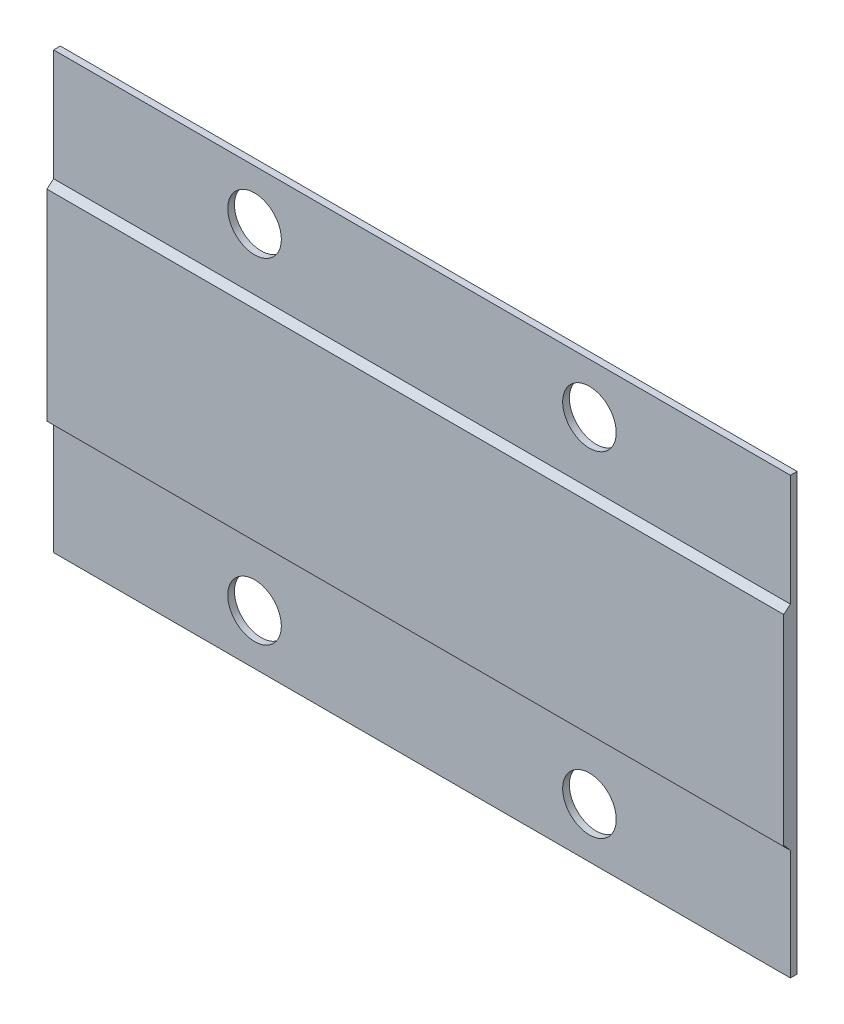
ISO-10303-21;
HEADER;
FILE_DESCRIPTION(('STEP AP214'),'2;1');
FILE_NAME('part.step','',(''),(''),'','','');
FILE_SCHEMA(('AUTOMOTIVE_DESIGN { 1 0 10303 214 1 1 1 1 }'));
ENDSEC;
DATA;
#1=APPLICATION_CONTEXT('core data for automotive mechanical design processes');
#2=APPLICATION_PROTOCOL_DEFINITION('international standard','automotive_design',2000,#1);
#3=PRODUCT_CONTEXT('',#1,'mechanical');
#4=PRODUCT('Part','Part','',(#3));
#5=PRODUCT_RELATED_PRODUCT_CATEGORY('part','',(#4));
#6=PRODUCT_DEFINITION_FORMATION('','',#4);
#7=PRODUCT_DEFINITION_CONTEXT('part definition',#1,'design');
#8=PRODUCT_DEFINITION('design','',#6,#7);
#9=PRODUCT_DEFINITION_SHAPE('','',#8);
#10=(LENGTH_UNIT() NAMED_UNIT(*) SI_UNIT(.MILLI.,.METRE.));
#11=(NAMED_UNIT(*) PLANE_ANGLE_UNIT() SI_UNIT($,.RADIAN.));
#12=(NAMED_UNIT(*) SI_UNIT($,.STERADIAN.) SOLID_ANGLE_UNIT());
#13=UNCERTAINTY_MEASURE_WITH_UNIT(LENGTH_MEASURE(1.E-05),#10,'distance_accuracy_value','');
#14=(GEOMETRIC_REPRESENTATION_CONTEXT(3) GLOBAL_UNCERTAINTY_ASSIGNED_CONTEXT((#13)) GLOBAL_UNIT_ASSIGNED_CONTEXT((#10,
#11,#12)) REPRESENTATION_CONTEXT('',''));
#15=CARTESIAN_POINT('',(0.,0.,0.));
#16=DIRECTION('',(0.,0.,1.));
#17=DIRECTION('',(1.,0.,0.));
#18=AXIS2_PLACEMENT_3D('',#15,#16,#17);
#19=CARTESIAN_POINT('',(0.,0.,0.4));
#20=DIRECTION('',(0.,0.,1.));
#21=DIRECTION('',(1.,0.,0.));
#22=AXIS2_PLACEMENT_3D('',#19,#20,#21);
#23=PLANE('',#22);
#24=CARTESIAN_POINT('',(12.,23.,0.4));
#25=DIRECTION('',(0.,0.,1.));
#26=DIRECTION('',(1.,0.,0.));
#27=AXIS2_PLACEMENT_3D('',#24,#25,#26);
#28=CIRCLE('',#27,1.6);
#29=CARTESIAN_POINT('',(13.6,23.,0.4));
#30=VERTEX_POINT('',#29);
#31=EDGE_CURVE('E155',#30,#30,#28,.T.);
#32=ORIENTED_EDGE('',*,*,#31,.F.);
#33=EDGE_LOOP('',(#32));
#34=FACE_BOUND('',#33,.T.);
#35=CARTESIAN_POINT('',(32.,23.,0.4));
#36=DIRECTION('',(0.,0.,1.));
#37=DIRECTION('',(1.,0.,0.));
#38=AXIS2_PLACEMENT_3D('',#35,#36,#37);
#39=CIRCLE('',#38,1.6);
#40=CARTESIAN_POINT('',(33.6,23.,0.4));
#41=VERTEX_POINT('',#40);
#42=EDGE_CURVE('E152',#41,#41,#39,.T.);
#43=ORIENTED_EDGE('',*,*,#42,.F.);
#44=EDGE_LOOP('',(#43));
#45=FACE_BOUND('',#44,.T.);
#46=DIRECTION('',(0.,1.,0.));
#47=VECTOR('',#46,1.);
#48=CARTESIAN_POINT('',(0.,0.,0.4));
#49=LINE('',#48,#47);
#50=CARTESIAN_POINT('',(0.,19.3356398524709,0.4));
#51=VERTEX_POINT('',#50);
#52=CARTESIAN_POINT('',(0.,26.,0.4));
#53=VERTEX_POINT('',#52);
#54=EDGE_CURVE('E168',#51,#53,#49,.T.);
#55=ORIENTED_EDGE('',*,*,#54,.F.);
#56=DIRECTION('',(1.,0.,0.));
#57=VECTOR('',#56,1.);
#58=CARTESIAN_POINT('',(44.,19.3356398524709,0.4));
#59=LINE('',#58,#57);
#60=CARTESIAN_POINT('',(44.,19.3356398524709,0.4));
#61=VERTEX_POINT('',#60);
#62=EDGE_CURVE('E203',#51,#61,#59,.T.);
#63=ORIENTED_EDGE('',*,*,#62,.T.);
#64=DIRECTION('',(0.,1.,0.));
#65=VECTOR('',#64,1.);
#66=CARTESIAN_POINT('',(44.,0.,0.4));
#67=LINE('',#66,#65);
#68=CARTESIAN_POINT('',(44.,26.,0.4));
#69=VERTEX_POINT('',#68);
#70=EDGE_CURVE('E161',#61,#69,#67,.T.);
#71=ORIENTED_EDGE('',*,*,#70,.T.);
#72=DIRECTION('',(1.,0.,0.));
#73=VECTOR('',#72,1.);
#74=CARTESIAN_POINT('',(0.,26.,0.4));
#75=LINE('',#74,#73);
#76=EDGE_CURVE('E165',#53,#69,#75,.T.);
#77=ORIENTED_EDGE('',*,*,#76,.F.);
#78=EDGE_LOOP('',(#55,#63,#71,#77));
#79=FACE_BOUND('',#78,.T.);
#80=ADVANCED_FACE('F43',(#34,#45,#79),#23,.T.);
#81=CARTESIAN_POINT('',(0.,0.,0.4));
#82=DIRECTION('',(0.,1.,0.));
#83=DIRECTION('',(0.,0.,1.));
#84=AXIS2_PLACEMENT_3D('',#81,#82,#83);
#85=PLANE('',#84);
#86=DIRECTION('',(1.,0.,0.));
#87=VECTOR('',#86,1.);
#88=CARTESIAN_POINT('',(0.,0.,0.));
#89=LINE('',#88,#87);
#90=CARTESIAN_POINT('',(0.,0.,0.));
#91=VERTEX_POINT('',#90);
#92=CARTESIAN_POINT('',(44.,0.,0.));
#93=VERTEX_POINT('',#92);
#94=EDGE_CURVE('E180',#91,#93,#89,.T.);
#95=ORIENTED_EDGE('',*,*,#94,.T.);
#96=DIRECTION('',(0.,0.,-1.));
#97=VECTOR('',#96,1.);
#98=CARTESIAN_POINT('',(44.,0.,0.4));
#99=LINE('',#98,#97);
#100=CARTESIAN_POINT('',(44.,0.,0.4));
#101=VERTEX_POINT('',#100);
#102=EDGE_CURVE('E196',#101,#93,#99,.T.);
#103=ORIENTED_EDGE('',*,*,#102,.F.);
#104=DIRECTION('',(1.,0.,0.));
#105=VECTOR('',#104,1.);
#106=CARTESIAN_POINT('',(0.,0.,0.4));
#107=LINE('',#106,#105);
#108=CARTESIAN_POINT('',(0.,0.,0.4));
#109=VERTEX_POINT('',#108);
#110=EDGE_CURVE('E158',#109,#101,#107,.T.);
#111=ORIENTED_EDGE('',*,*,#110,.F.);
#112=DIRECTION('',(0.,0.,-1.));
#113=VECTOR('',#112,1.);
#114=CARTESIAN_POINT('',(0.,0.,0.4));
#115=LINE('',#114,#113);
#116=EDGE_CURVE('E170',#109,#91,#115,.T.);
#117=ORIENTED_EDGE('',*,*,#116,.T.);
#118=EDGE_LOOP('',(#95,#103,#111,#117));
#119=FACE_BOUND('',#118,.T.);
#120=ADVANCED_FACE('F225',(#119),#85,.F.);
#121=CARTESIAN_POINT('',(44.,0.,0.4));
#122=DIRECTION('',(-1.,0.,0.));
#123=DIRECTION('',(0.,0.,1.));
#124=AXIS2_PLACEMENT_3D('',#121,#122,#123);
#125=PLANE('',#124);
#126=DIRECTION('',(0.,1.,0.));
#127=VECTOR('',#126,1.);
#128=CARTESIAN_POINT('',(44.,0.,0.));
#129=LINE('',#128,#127);
#130=CARTESIAN_POINT('',(44.,26.,0.));
#131=VERTEX_POINT('',#130);
#132=EDGE_CURVE('E183',#93,#131,#129,.T.);
#133=ORIENTED_EDGE('',*,*,#132,.T.);
#134=DIRECTION('',(0.,0.,-1.));
#135=VECTOR('',#134,1.);
#136=CARTESIAN_POINT('',(44.,26.,0.4));
#137=LINE('',#136,#135);
#138=EDGE_CURVE('E194',#69,#131,#137,.T.);
#139=ORIENTED_EDGE('',*,*,#138,.F.);
#140=ORIENTED_EDGE('',*,*,#70,.F.);
#141=DIRECTION('',(0.,0.642787609686543,-0.766044443118975));
#142=VECTOR('',#141,1.);
#143=CARTESIAN_POINT('',(44.,11.3466192384382,9.92094401808262));
#144=LINE('',#143,#142);
#145=CARTESIAN_POINT('',(44.,19.,0.8));
#146=VERTEX_POINT('',#145);
#147=EDGE_CURVE('E52',#61,#146,#144,.F.);
#148=ORIENTED_EDGE('',*,*,#147,.T.);
#149=DIRECTION('',(0.,1.,0.));
#150=VECTOR('',#149,1.);
#151=CARTESIAN_POINT('',(44.,0.,0.8));
#152=LINE('',#151,#150);
#153=CARTESIAN_POINT('',(44.,6.99999999999999,0.8));
#154=VERTEX_POINT('',#153);
#155=EDGE_CURVE('E125',#154,#146,#152,.T.);
#156=ORIENTED_EDGE('',*,*,#155,.F.);
#157=DIRECTION('',(0.,0.,-1.));
#158=VECTOR('',#157,1.);
#159=CARTESIAN_POINT('',(44.,6.99999999999999,0.8));
#160=LINE('',#159,#158);
#161=CARTESIAN_POINT('',(44.,6.99999999999999,0.735639852470905));
#162=VERTEX_POINT('',#161);
#163=EDGE_CURVE('E121',#154,#162,#160,.T.);
#164=ORIENTED_EDGE('',*,*,#163,.T.);
#165=DIRECTION('',(0.,-0.766044443118977,-0.64278760968654));
#166=VECTOR('',#165,1.);
#167=CARTESIAN_POINT('',(44.,2.72696101369914,-2.84986558494029));
#168=LINE('',#167,#166);
#169=CARTESIAN_POINT('',(44.,6.59999999999999,0.4));
#170=VERTEX_POINT('',#169);
#171=EDGE_CURVE('E205',#162,#170,#168,.T.);
#172=ORIENTED_EDGE('',*,*,#171,.T.);
#173=EDGE_CURVE('E162',#101,#170,#67,.T.);
#174=ORIENTED_EDGE('',*,*,#173,.F.);
#175=ORIENTED_EDGE('',*,*,#102,.T.);
#176=EDGE_LOOP('',(#133,#139,#140,#148,#156,#164,#172,#174,#175));
#177=FACE_BOUND('',#176,.T.);
#178=ADVANCED_FACE('F209',(#177),#125,.F.);
#179=CARTESIAN_POINT('',(0.,26.,0.4));
#180=DIRECTION('',(0.,1.,0.));
#181=DIRECTION('',(0.,0.,1.));
#182=AXIS2_PLACEMENT_3D('',#179,#180,#181);
#183=PLANE('',#182);
#184=DIRECTION('',(1.,0.,0.));
#185=VECTOR('',#184,1.);
#186=CARTESIAN_POINT('',(0.,26.,0.));
#187=LINE('',#186,#185);
#188=CARTESIAN_POINT('',(0.,26.,0.));
#189=VERTEX_POINT('',#188);
#190=EDGE_CURVE('E186',#189,#131,#187,.T.);
#191=ORIENTED_EDGE('',*,*,#190,.F.);
#192=DIRECTION('',(0.,0.,-1.));
#193=VECTOR('',#192,1.);
#194=CARTESIAN_POINT('',(0.,26.,0.4));
#195=LINE('',#194,#193);
#196=EDGE_CURVE('E192',#53,#189,#195,.T.);
#197=ORIENTED_EDGE('',*,*,#196,.F.);
#198=ORIENTED_EDGE('',*,*,#76,.T.);
#199=ORIENTED_EDGE('',*,*,#138,.T.);
#200=EDGE_LOOP('',(#191,#197,#198,#199));
#201=FACE_BOUND('',#200,.T.);
#202=ADVANCED_FACE('F217',(#201),#183,.T.);
#203=CARTESIAN_POINT('',(12.,23.,0.4));
#204=DIRECTION('',(0.,0.,-1.));
#205=DIRECTION('',(-1.,0.,0.));
#206=AXIS2_PLACEMENT_3D('',#203,#204,#205);
#207=CYLINDRICAL_SURFACE('',#206,1.6);
#208=ORIENTED_EDGE('',*,*,#31,.T.);
#209=EDGE_LOOP('',(#208));
#210=FACE_BOUND('',#209,.T.);
#211=CARTESIAN_POINT('',(12.,23.,0.));
#212=DIRECTION('',(0.,0.,1.));
#213=DIRECTION('',(1.,0.,0.));
#214=AXIS2_PLACEMENT_3D('',#211,#212,#213);
#215=CIRCLE('',#214,1.6);
#216=CARTESIAN_POINT('',(13.6,23.,0.));
#217=VERTEX_POINT('',#216);
#218=EDGE_CURVE('E177',#217,#217,#215,.T.);
#219=ORIENTED_EDGE('',*,*,#218,.F.);
#220=EDGE_LOOP('',(#219));
#221=FACE_BOUND('',#220,.T.);
#222=ADVANCED_FACE('F269',(#210,#221),#207,.F.);
#223=CARTESIAN_POINT('',(32.,23.,0.4));
#224=DIRECTION('',(0.,0.,-1.));
#225=DIRECTION('',(-1.,0.,0.));
#226=AXIS2_PLACEMENT_3D('',#223,#224,#225);
#227=CYLINDRICAL_SURFACE('',#226,1.6);
#228=ORIENTED_EDGE('',*,*,#42,.T.);
#229=EDGE_LOOP('',(#228));
#230=FACE_BOUND('',#229,.T.);
#231=CARTESIAN_POINT('',(32.,23.,0.));
#232=DIRECTION('',(0.,0.,1.));
#233=DIRECTION('',(1.,0.,0.));
#234=AXIS2_PLACEMENT_3D('',#231,#232,#233);
#235=CIRCLE('',#234,1.6);
#236=CARTESIAN_POINT('',(33.6,23.,0.));
#237=VERTEX_POINT('',#236);
#238=EDGE_CURVE('E174',#237,#237,#235,.T.);
#239=ORIENTED_EDGE('',*,*,#238,.F.);
#240=EDGE_LOOP('',(#239));
#241=FACE_BOUND('',#240,.T.);
#242=ADVANCED_FACE('F273',(#230,#241),#227,.F.);
#243=CARTESIAN_POINT('',(12.,3.,0.4));
#244=DIRECTION('',(0.,0.,-1.));
#245=DIRECTION('',(-1.,0.,0.));
#246=AXIS2_PLACEMENT_3D('',#243,#244,#245);
#247=CYLINDRICAL_SURFACE('',#246,1.6);
#248=CARTESIAN_POINT('',(12.,3.,0.4));
#249=DIRECTION('',(0.,0.,1.));
#250=DIRECTION('',(1.,0.,0.));
#251=AXIS2_PLACEMENT_3D('',#248,#249,#250);
#252=CIRCLE('',#251,1.6);
#253=CARTESIAN_POINT('',(13.6,3.,0.4));
#254=VERTEX_POINT('',#253);
#255=EDGE_CURVE('E148',#254,#254,#252,.T.);
#256=ORIENTED_EDGE('',*,*,#255,.T.);
#257=EDGE_LOOP('',(#256));
#258=FACE_BOUND('',#257,.T.);
#259=CARTESIAN_POINT('',(12.,3.,0.));
#260=DIRECTION('',(0.,0.,1.));
#261=DIRECTION('',(1.,0.,0.));
#262=AXIS2_PLACEMENT_3D('',#259,#260,#261);
#263=CIRCLE('',#262,1.6);
#264=CARTESIAN_POINT('',(13.6,3.,0.));
#265=VERTEX_POINT('',#264);
#266=EDGE_CURVE('E140',#265,#265,#263,.T.);
#267=ORIENTED_EDGE('',*,*,#266,.F.);
#268=EDGE_LOOP('',(#267));
#269=FACE_BOUND('',#268,.T.);
#270=ADVANCED_FACE('F264',(#258,#269),#247,.F.);
#271=CARTESIAN_POINT('',(32.,3.,0.4));
#272=DIRECTION('',(0.,0.,-1.));
#273=DIRECTION('',(-1.,0.,0.));
#274=AXIS2_PLACEMENT_3D('',#271,#272,#273);
#275=CYLINDRICAL_SURFACE('',#274,1.6);
#276=CARTESIAN_POINT('',(32.,3.,0.4));
#277=DIRECTION('',(0.,0.,1.));
#278=DIRECTION('',(1.,0.,0.));
#279=AXIS2_PLACEMENT_3D('',#276,#277,#278);
#280=CIRCLE('',#279,1.6);
#281=CARTESIAN_POINT('',(33.6,3.,0.4));
#282=VERTEX_POINT('',#281);
#283=EDGE_CURVE('E145',#282,#282,#280,.T.);
#284=ORIENTED_EDGE('',*,*,#283,.T.);
#285=EDGE_LOOP('',(#284));
#286=FACE_BOUND('',#285,.T.);
#287=CARTESIAN_POINT('',(32.,3.,0.));
#288=DIRECTION('',(0.,0.,1.));
#289=DIRECTION('',(1.,0.,0.));
#290=AXIS2_PLACEMENT_3D('',#287,#288,#289);
#291=CIRCLE('',#290,1.6);
#292=CARTESIAN_POINT('',(33.6,3.,0.));
#293=VERTEX_POINT('',#292);
#294=EDGE_CURVE('E137',#293,#293,#291,.T.);
#295=ORIENTED_EDGE('',*,*,#294,.F.);
#296=EDGE_LOOP('',(#295));
#297=FACE_BOUND('',#296,.T.);
#298=ADVANCED_FACE('F259',(#286,#297),#275,.F.);
#299=CARTESIAN_POINT('',(0.,0.,0.4));
#300=DIRECTION('',(-1.,0.,0.));
#301=DIRECTION('',(0.,0.,1.));
#302=AXIS2_PLACEMENT_3D('',#299,#300,#301);
#303=PLANE('',#302);
#304=DIRECTION('',(0.,1.,0.));
#305=VECTOR('',#304,1.);
#306=CARTESIAN_POINT('',(0.,0.,0.));
#307=LINE('',#306,#305);
#308=EDGE_CURVE('E149',#91,#189,#307,.T.);
#309=ORIENTED_EDGE('',*,*,#308,.F.);
#310=ORIENTED_EDGE('',*,*,#116,.F.);
#311=CARTESIAN_POINT('',(0.,6.59999999999999,0.4));
#312=VERTEX_POINT('',#311);
#313=EDGE_CURVE('E169',#109,#312,#49,.T.);
#314=ORIENTED_EDGE('',*,*,#313,.T.);
#315=DIRECTION('',(0.,0.766044443118977,0.64278760968654));
#316=VECTOR('',#315,1.);
#317=CARTESIAN_POINT('',(0.,6.99999999999999,0.735639852470905));
#318=LINE('',#317,#316);
#319=CARTESIAN_POINT('',(0.,6.99999999999999,0.735639852470905));
#320=VERTEX_POINT('',#319);
#321=EDGE_CURVE('E136',#312,#320,#318,.T.);
#322=ORIENTED_EDGE('',*,*,#321,.T.);
#323=DIRECTION('',(0.,0.,-1.));
#324=VECTOR('',#323,1.);
#325=CARTESIAN_POINT('',(0.,6.99999999999999,0.8));
#326=LINE('',#325,#324);
#327=CARTESIAN_POINT('',(0.,6.99999999999999,0.8));
#328=VERTEX_POINT('',#327);
#329=EDGE_CURVE('E118',#328,#320,#326,.T.);
#330=ORIENTED_EDGE('',*,*,#329,.F.);
#331=DIRECTION('',(0.,-1.,0.));
#332=VECTOR('',#331,1.);
#333=CARTESIAN_POINT('',(0.,0.,0.8));
#334=LINE('',#333,#332);
#335=CARTESIAN_POINT('',(0.,19.,0.8));
#336=VERTEX_POINT('',#335);
#337=EDGE_CURVE('E126',#336,#328,#334,.T.);
#338=ORIENTED_EDGE('',*,*,#337,.F.);
#339=DIRECTION('',(0.,-0.642787609686543,0.766044443118975));
#340=VECTOR('',#339,1.);
#341=CARTESIAN_POINT('',(0.,19.3356398524709,0.4));
#342=LINE('',#341,#340);
#343=EDGE_CURVE('E11',#336,#51,#342,.F.);
#344=ORIENTED_EDGE('',*,*,#343,.T.);
#345=ORIENTED_EDGE('',*,*,#54,.T.);
#346=ORIENTED_EDGE('',*,*,#196,.T.);
#347=EDGE_LOOP('',(#309,#310,#314,#322,#330,#338,#344,#345,#346));
#348=FACE_BOUND('',#347,.T.);
#349=ADVANCED_FACE('F133',(#348),#303,.T.);
#350=ORIENTED_EDGE('',*,*,#173,.T.);
#351=DIRECTION('',(-1.,0.,0.));
#352=VECTOR('',#351,1.);
#353=CARTESIAN_POINT('',(0.,6.59999999999999,0.4));
#354=LINE('',#353,#352);
#355=EDGE_CURVE('E201',#170,#312,#354,.T.);
#356=ORIENTED_EDGE('',*,*,#355,.T.);
#357=ORIENTED_EDGE('',*,*,#313,.F.);
#358=ORIENTED_EDGE('',*,*,#110,.T.);
#359=EDGE_LOOP('',(#350,#356,#357,#358));
#360=FACE_BOUND('',#359,.T.);
#361=ORIENTED_EDGE('',*,*,#283,.F.);
#362=EDGE_LOOP('',(#361));
#363=FACE_BOUND('',#362,.T.);
#364=ORIENTED_EDGE('',*,*,#255,.F.);
#365=EDGE_LOOP('',(#364));
#366=FACE_BOUND('',#365,.T.);
#367=ADVANCED_FACE('F227',(#360,#363,#366),#23,.T.);
#368=CARTESIAN_POINT('',(0.,0.,0.));
#369=DIRECTION('',(0.,0.,1.));
#370=DIRECTION('',(1.,0.,0.));
#371=AXIS2_PLACEMENT_3D('',#368,#369,#370);
#372=PLANE('',#371);
#373=ORIENTED_EDGE('',*,*,#294,.T.);
#374=EDGE_LOOP('',(#373));
#375=FACE_BOUND('',#374,.T.);
#376=ORIENTED_EDGE('',*,*,#266,.T.);
#377=EDGE_LOOP('',(#376));
#378=FACE_BOUND('',#377,.T.);
#379=ORIENTED_EDGE('',*,*,#238,.T.);
#380=EDGE_LOOP('',(#379));
#381=FACE_BOUND('',#380,.T.);
#382=ORIENTED_EDGE('',*,*,#218,.T.);
#383=EDGE_LOOP('',(#382));
#384=FACE_BOUND('',#383,.T.);
#385=ORIENTED_EDGE('',*,*,#94,.F.);
#386=ORIENTED_EDGE('',*,*,#308,.T.);
#387=ORIENTED_EDGE('',*,*,#190,.T.);
#388=ORIENTED_EDGE('',*,*,#132,.F.);
#389=EDGE_LOOP('',(#385,#386,#387,#388));
#390=FACE_BOUND('',#389,.T.);
#391=ADVANCED_FACE('F220',(#375,#378,#381,#384,#390),#372,.F.);
#392=CARTESIAN_POINT('',(0.,6.99999999999999,0.8));
#393=DIRECTION('',(0.,1.,0.));
#394=DIRECTION('',(0.,0.,1.));
#395=AXIS2_PLACEMENT_3D('',#392,#393,#394);
#396=PLANE('',#395);
#397=ORIENTED_EDGE('',*,*,#329,.T.);
#398=DIRECTION('',(1.,0.,0.));
#399=VECTOR('',#398,1.);
#400=CARTESIAN_POINT('',(0.,6.99999999999999,0.735639852470905));
#401=LINE('',#400,#399);
#402=EDGE_CURVE('E199',#320,#162,#401,.T.);
#403=ORIENTED_EDGE('',*,*,#402,.T.);
#404=ORIENTED_EDGE('',*,*,#163,.F.);
#405=DIRECTION('',(1.,0.,0.));
#406=VECTOR('',#405,1.);
#407=CARTESIAN_POINT('',(0.,6.99999999999999,0.8));
#408=LINE('',#407,#406);
#409=EDGE_CURVE('E113',#328,#154,#408,.T.);
#410=ORIENTED_EDGE('',*,*,#409,.F.);
#411=EDGE_LOOP('',(#397,#403,#404,#410));
#412=FACE_BOUND('',#411,.T.);
#413=ADVANCED_FACE('F115',(#412),#396,.F.);
#414=CARTESIAN_POINT('',(0.,0.,0.8));
#415=DIRECTION('',(0.,0.,1.));
#416=DIRECTION('',(1.,0.,0.));
#417=AXIS2_PLACEMENT_3D('',#414,#415,#416);
#418=PLANE('',#417);
#419=ORIENTED_EDGE('',*,*,#337,.T.);
#420=ORIENTED_EDGE('',*,*,#409,.T.);
#421=ORIENTED_EDGE('',*,*,#155,.T.);
#422=DIRECTION('',(1.,0.,0.));
#423=VECTOR('',#422,1.);
#424=CARTESIAN_POINT('',(0.,19.,0.8));
#425=LINE('',#424,#423);
#426=EDGE_CURVE('E130',#336,#146,#425,.T.);
#427=ORIENTED_EDGE('',*,*,#426,.F.);
#428=EDGE_LOOP('',(#419,#420,#421,#427));
#429=FACE_BOUND('',#428,.T.);
#430=ADVANCED_FACE('F129',(#429),#418,.T.);
#431=CARTESIAN_POINT('',(0.,6.99999999999999,0.735639852470905));
#432=DIRECTION('',(0.,0.64278760968654,-0.766044443118977));
#433=DIRECTION('',(1.,0.,0.));
#434=AXIS2_PLACEMENT_3D('',#431,#432,#433);
#435=PLANE('',#434);
#436=ORIENTED_EDGE('',*,*,#321,.F.);
#437=ORIENTED_EDGE('',*,*,#355,.F.);
#438=ORIENTED_EDGE('',*,*,#171,.F.);
#439=ORIENTED_EDGE('',*,*,#402,.F.);
#440=EDGE_LOOP('',(#436,#437,#438,#439));
#441=FACE_BOUND('',#440,.T.);
#442=ADVANCED_FACE('F231',(#441),#435,.F.);
#443=CARTESIAN_POINT('',(0.,19.3356398524709,0.4));
#444=DIRECTION('',(0.,0.766044443118975,0.642787609686543));
#445=DIRECTION('',(-1.,0.,0.));
#446=AXIS2_PLACEMENT_3D('',#443,#444,#445);
#447=PLANE('',#446);
#448=ORIENTED_EDGE('',*,*,#343,.F.);
#449=ORIENTED_EDGE('',*,*,#426,.T.);
#450=ORIENTED_EDGE('',*,*,#147,.F.);
#451=ORIENTED_EDGE('',*,*,#62,.F.);
#452=EDGE_LOOP('',(#448,#449,#450,#451));
#453=FACE_BOUND('',#452,.T.);
#454=ADVANCED_FACE('F46',(#453),#447,.T.);
#455=CLOSED_SHELL('',(#80,#120,#178,#202,#222,#242,#270,#298,#349,#367,#391,#413,#430,#442,#454));
#456=MANIFOLD_SOLID_BREP('B2',#455);
#457=ADVANCED_BREP_SHAPE_REPRESENTATION('',(#18,#456),#14);
#458=SHAPE_DEFINITION_REPRESENTATION(#9,#457);
ENDSEC;
END-ISO-10303-21;
